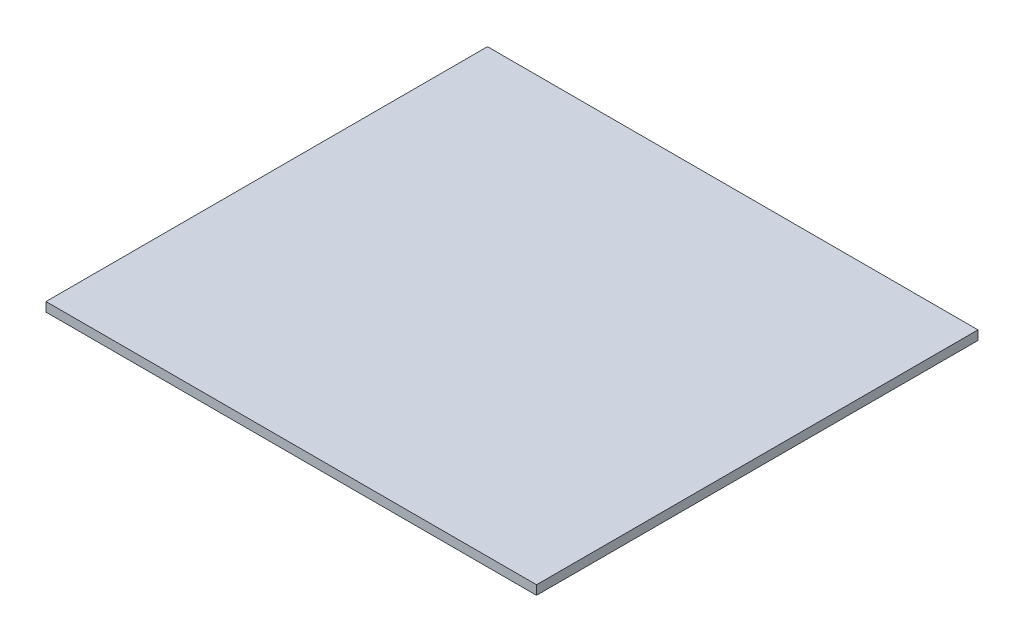
ISO-10303-21;
HEADER;
FILE_DESCRIPTION(('STEP AP214'),'2;1');
FILE_NAME('part.step','',(''),(''),'','','');
FILE_SCHEMA(('AUTOMOTIVE_DESIGN { 1 0 10303 214 1 1 1 1 }'));
ENDSEC;
DATA;
#1=APPLICATION_CONTEXT('core data for automotive mechanical design processes');
#2=APPLICATION_PROTOCOL_DEFINITION('international standard','automotive_design',2000,#1);
#3=PRODUCT_CONTEXT('',#1,'mechanical');
#4=PRODUCT('Part','Part','',(#3));
#5=PRODUCT_RELATED_PRODUCT_CATEGORY('part','',(#4));
#6=PRODUCT_DEFINITION_FORMATION('','',#4);
#7=PRODUCT_DEFINITION_CONTEXT('part definition',#1,'design');
#8=PRODUCT_DEFINITION('design','',#6,#7);
#9=PRODUCT_DEFINITION_SHAPE('','',#8);
#10=(LENGTH_UNIT() NAMED_UNIT(*) SI_UNIT(.MILLI.,.METRE.));
#11=(NAMED_UNIT(*) PLANE_ANGLE_UNIT() SI_UNIT($,.RADIAN.));
#12=(NAMED_UNIT(*) SI_UNIT($,.STERADIAN.) SOLID_ANGLE_UNIT());
#13=UNCERTAINTY_MEASURE_WITH_UNIT(LENGTH_MEASURE(1.E-05),#10,'distance_accuracy_value','');
#14=(GEOMETRIC_REPRESENTATION_CONTEXT(3) GLOBAL_UNCERTAINTY_ASSIGNED_CONTEXT((#13)) GLOBAL_UNIT_ASSIGNED_CONTEXT((#10,
#11,#12)) REPRESENTATION_CONTEXT('',''));
#15=CARTESIAN_POINT('',(0.,0.,0.));
#16=DIRECTION('',(0.,0.,1.));
#17=DIRECTION('',(1.,0.,0.));
#18=AXIS2_PLACEMENT_3D('',#15,#16,#17);
#19=CARTESIAN_POINT('',(0.,19.05,0.));
#20=DIRECTION('',(1.,0.,0.));
#21=DIRECTION('',(0.,0.,-1.));
#22=AXIS2_PLACEMENT_3D('',#19,#20,#21);
#23=PLANE('',#22);
#24=DIRECTION('',(0.,0.,1.));
#25=VECTOR('',#24,1.);
#26=CARTESIAN_POINT('',(0.,0.,0.));
#27=LINE('',#26,#25);
#28=CARTESIAN_POINT('',(0.,0.,-914.4));
#29=VERTEX_POINT('',#28);
#30=CARTESIAN_POINT('',(0.,0.,0.));
#31=VERTEX_POINT('',#30);
#32=EDGE_CURVE('E97',#29,#31,#27,.T.);
#33=ORIENTED_EDGE('',*,*,#32,.T.);
#34=DIRECTION('',(0.,-1.,0.));
#35=VECTOR('',#34,1.);
#36=CARTESIAN_POINT('',(0.,19.05,0.));
#37=LINE('',#36,#35);
#38=CARTESIAN_POINT('',(0.,19.05,0.));
#39=VERTEX_POINT('',#38);
#40=EDGE_CURVE('E11',#39,#31,#37,.T.);
#41=ORIENTED_EDGE('',*,*,#40,.F.);
#42=DIRECTION('',(0.,0.,1.));
#43=VECTOR('',#42,1.);
#44=CARTESIAN_POINT('',(0.,19.05,0.));
#45=LINE('',#44,#43);
#46=CARTESIAN_POINT('',(0.,19.05,-914.4));
#47=VERTEX_POINT('',#46);
#48=EDGE_CURVE('E85',#47,#39,#45,.T.);
#49=ORIENTED_EDGE('',*,*,#48,.F.);
#50=DIRECTION('',(0.,-1.,0.));
#51=VECTOR('',#50,1.);
#52=CARTESIAN_POINT('',(0.,19.05,-914.4));
#53=LINE('',#52,#51);
#54=EDGE_CURVE('E93',#47,#29,#53,.T.);
#55=ORIENTED_EDGE('',*,*,#54,.T.);
#56=EDGE_LOOP('',(#33,#41,#49,#55));
#57=FACE_BOUND('',#56,.T.);
#58=ADVANCED_FACE('F34',(#57),#23,.F.);
#59=CARTESIAN_POINT('',(0.,19.05,0.));
#60=DIRECTION('',(0.,0.,-1.));
#61=DIRECTION('',(-1.,0.,0.));
#62=AXIS2_PLACEMENT_3D('',#59,#60,#61);
#63=PLANE('',#62);
#64=DIRECTION('',(1.,0.,0.));
#65=VECTOR('',#64,1.);
#66=CARTESIAN_POINT('',(0.,0.,0.));
#67=LINE('',#66,#65);
#68=CARTESIAN_POINT('',(1016.,0.,0.));
#69=VERTEX_POINT('',#68);
#70=EDGE_CURVE('E89',#31,#69,#67,.T.);
#71=ORIENTED_EDGE('',*,*,#70,.T.);
#72=DIRECTION('',(0.,-1.,0.));
#73=VECTOR('',#72,1.);
#74=CARTESIAN_POINT('',(1016.,19.05,0.));
#75=LINE('',#74,#73);
#76=CARTESIAN_POINT('',(1016.,19.05,0.));
#77=VERTEX_POINT('',#76);
#78=EDGE_CURVE('E42',#77,#69,#75,.T.);
#79=ORIENTED_EDGE('',*,*,#78,.F.);
#80=DIRECTION('',(1.,0.,0.));
#81=VECTOR('',#80,1.);
#82=CARTESIAN_POINT('',(0.,19.05,0.));
#83=LINE('',#82,#81);
#84=EDGE_CURVE('E80',#39,#77,#83,.T.);
#85=ORIENTED_EDGE('',*,*,#84,.F.);
#86=ORIENTED_EDGE('',*,*,#40,.T.);
#87=EDGE_LOOP('',(#71,#79,#85,#86));
#88=FACE_BOUND('',#87,.T.);
#89=ADVANCED_FACE('F88',(#88),#63,.F.);
#90=CARTESIAN_POINT('',(1016.,19.05,0.));
#91=DIRECTION('',(-1.,0.,0.));
#92=DIRECTION('',(0.,0.,1.));
#93=AXIS2_PLACEMENT_3D('',#90,#91,#92);
#94=PLANE('',#93);
#95=DIRECTION('',(0.,0.,-1.));
#96=VECTOR('',#95,1.);
#97=CARTESIAN_POINT('',(1016.,0.,0.));
#98=LINE('',#97,#96);
#99=CARTESIAN_POINT('',(1016.,0.,-914.4));
#100=VERTEX_POINT('',#99);
#101=EDGE_CURVE('E67',#69,#100,#98,.T.);
#102=ORIENTED_EDGE('',*,*,#101,.T.);
#103=DIRECTION('',(0.,-1.,0.));
#104=VECTOR('',#103,1.);
#105=CARTESIAN_POINT('',(1016.,19.05,-914.4));
#106=LINE('',#105,#104);
#107=CARTESIAN_POINT('',(1016.,19.05,-914.4));
#108=VERTEX_POINT('',#107);
#109=EDGE_CURVE('E90',#108,#100,#106,.T.);
#110=ORIENTED_EDGE('',*,*,#109,.F.);
#111=DIRECTION('',(0.,0.,-1.));
#112=VECTOR('',#111,1.);
#113=CARTESIAN_POINT('',(1016.,19.05,0.));
#114=LINE('',#113,#112);
#115=EDGE_CURVE('E83',#77,#108,#114,.T.);
#116=ORIENTED_EDGE('',*,*,#115,.F.);
#117=ORIENTED_EDGE('',*,*,#78,.T.);
#118=EDGE_LOOP('',(#102,#110,#116,#117));
#119=FACE_BOUND('',#118,.T.);
#120=ADVANCED_FACE('F91',(#119),#94,.F.);
#121=CARTESIAN_POINT('',(0.,19.05,-914.4));
#122=DIRECTION('',(0.,0.,1.));
#123=DIRECTION('',(1.,0.,0.));
#124=AXIS2_PLACEMENT_3D('',#121,#122,#123);
#125=PLANE('',#124);
#126=DIRECTION('',(-1.,0.,0.));
#127=VECTOR('',#126,1.);
#128=CARTESIAN_POINT('',(0.,0.,-914.4));
#129=LINE('',#128,#127);
#130=EDGE_CURVE('E73',#100,#29,#129,.T.);
#131=ORIENTED_EDGE('',*,*,#130,.T.);
#132=ORIENTED_EDGE('',*,*,#54,.F.);
#133=DIRECTION('',(-1.,0.,0.));
#134=VECTOR('',#133,1.);
#135=CARTESIAN_POINT('',(0.,19.05,-914.4));
#136=LINE('',#135,#134);
#137=EDGE_CURVE('E50',#108,#47,#136,.T.);
#138=ORIENTED_EDGE('',*,*,#137,.F.);
#139=ORIENTED_EDGE('',*,*,#109,.T.);
#140=EDGE_LOOP('',(#131,#132,#138,#139));
#141=FACE_BOUND('',#140,.T.);
#142=ADVANCED_FACE('F104',(#141),#125,.F.);
#143=CARTESIAN_POINT('',(0.,19.05,0.));
#144=DIRECTION('',(0.,-1.,0.));
#145=DIRECTION('',(0.,0.,-1.));
#146=AXIS2_PLACEMENT_3D('',#143,#144,#145);
#147=PLANE('',#146);
#148=ORIENTED_EDGE('',*,*,#48,.T.);
#149=ORIENTED_EDGE('',*,*,#84,.T.);
#150=ORIENTED_EDGE('',*,*,#115,.T.);
#151=ORIENTED_EDGE('',*,*,#137,.T.);
#152=EDGE_LOOP('',(#148,#149,#150,#151));
#153=FACE_BOUND('',#152,.T.);
#154=ADVANCED_FACE('F81',(#153),#147,.F.);
#155=CARTESIAN_POINT('',(0.,0.,0.));
#156=DIRECTION('',(0.,-1.,0.));
#157=DIRECTION('',(0.,0.,-1.));
#158=AXIS2_PLACEMENT_3D('',#155,#156,#157);
#159=PLANE('',#158);
#160=ORIENTED_EDGE('',*,*,#32,.F.);
#161=ORIENTED_EDGE('',*,*,#130,.F.);
#162=ORIENTED_EDGE('',*,*,#101,.F.);
#163=ORIENTED_EDGE('',*,*,#70,.F.);
#164=EDGE_LOOP('',(#160,#161,#162,#163));
#165=FACE_BOUND('',#164,.T.);
#166=ADVANCED_FACE('F107',(#165),#159,.T.);
#167=CLOSED_SHELL('',(#58,#89,#120,#142,#154,#166));
#168=MANIFOLD_SOLID_BREP('B2',#167);
#169=ADVANCED_BREP_SHAPE_REPRESENTATION('',(#18,#168),#14);
#170=SHAPE_DEFINITION_REPRESENTATION(#9,#169);
ENDSEC;
END-ISO-10303-21;
